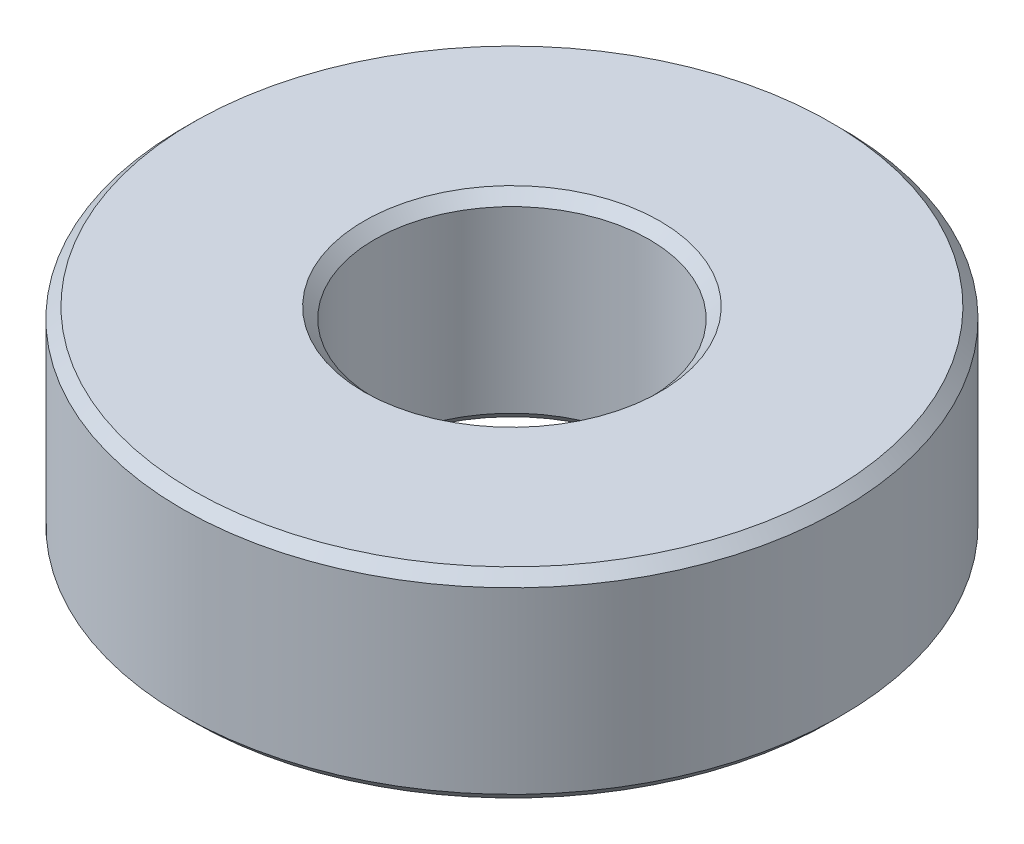
ISO-10303-21;
HEADER;
FILE_DESCRIPTION(('STEP AP214'),'2;1');
FILE_NAME('part.step','',(''),(''),'','','');
FILE_SCHEMA(('AUTOMOTIVE_DESIGN { 1 0 10303 214 1 1 1 1 }'));
ENDSEC;
DATA;
#1=APPLICATION_CONTEXT('core data for automotive mechanical design processes');
#2=APPLICATION_PROTOCOL_DEFINITION('international standard','automotive_design',2000,#1);
#3=PRODUCT_CONTEXT('',#1,'mechanical');
#4=PRODUCT('Part','Part','',(#3));
#5=PRODUCT_RELATED_PRODUCT_CATEGORY('part','',(#4));
#6=PRODUCT_DEFINITION_FORMATION('','',#4);
#7=PRODUCT_DEFINITION_CONTEXT('part definition',#1,'design');
#8=PRODUCT_DEFINITION('design','',#6,#7);
#9=PRODUCT_DEFINITION_SHAPE('','',#8);
#10=(LENGTH_UNIT() NAMED_UNIT(*) SI_UNIT(.MILLI.,.METRE.));
#11=(NAMED_UNIT(*) PLANE_ANGLE_UNIT() SI_UNIT($,.RADIAN.));
#12=(NAMED_UNIT(*) SI_UNIT($,.STERADIAN.) SOLID_ANGLE_UNIT());
#13=UNCERTAINTY_MEASURE_WITH_UNIT(LENGTH_MEASURE(1.E-05),#10,'distance_accuracy_value','');
#14=(GEOMETRIC_REPRESENTATION_CONTEXT(3) GLOBAL_UNCERTAINTY_ASSIGNED_CONTEXT((#13)) GLOBAL_UNIT_ASSIGNED_CONTEXT((#10,
#11,#12)) REPRESENTATION_CONTEXT('',''));
#15=CARTESIAN_POINT('',(0.,0.,0.));
#16=DIRECTION('',(0.,0.,1.));
#17=DIRECTION('',(1.,0.,0.));
#18=AXIS2_PLACEMENT_3D('',#15,#16,#17);
#19=CARTESIAN_POINT('',(0.,4.7752,0.));
#20=DIRECTION('',(0.,1.,0.));
#21=DIRECTION('',(0.,0.,1.));
#22=AXIS2_PLACEMENT_3D('',#19,#20,#21);
#23=PLANE('',#22);
#24=CARTESIAN_POINT('',(0.,4.7752,0.));
#25=DIRECTION('',(0.,1.,0.));
#26=DIRECTION('',(0.,0.,1.));
#27=AXIS2_PLACEMENT_3D('',#24,#25,#26);
#28=CIRCLE('',#27,3.5306);
#29=CARTESIAN_POINT('',(0.,4.7752,3.5306));
#30=VERTEX_POINT('',#29);
#31=EDGE_CURVE('E10',#30,#30,#28,.F.);
#32=ORIENTED_EDGE('',*,*,#31,.T.);
#33=EDGE_LOOP('',(#32));
#34=FACE_BOUND('',#33,.T.);
#35=CARTESIAN_POINT('',(0.,4.7752,0.));
#36=DIRECTION('',(0.,1.,0.));
#37=DIRECTION('',(0.,0.,1.));
#38=AXIS2_PLACEMENT_3D('',#35,#36,#37);
#39=CIRCLE('',#38,7.6073);
#40=CARTESIAN_POINT('',(0.,4.7752,7.6073));
#41=VERTEX_POINT('',#40);
#42=EDGE_CURVE('E48',#41,#41,#39,.T.);
#43=ORIENTED_EDGE('',*,*,#42,.T.);
#44=EDGE_LOOP('',(#43));
#45=FACE_BOUND('',#44,.T.);
#46=ADVANCED_FACE('F39',(#34,#45),#23,.T.);
#47=CARTESIAN_POINT('',(0.,0.,0.));
#48=DIRECTION('',(0.,1.,0.));
#49=DIRECTION('',(0.,0.,1.));
#50=AXIS2_PLACEMENT_3D('',#47,#48,#49);
#51=PLANE('',#50);
#52=CARTESIAN_POINT('',(0.,0.,0.));
#53=DIRECTION('',(0.,1.,0.));
#54=DIRECTION('',(0.,0.,1.));
#55=AXIS2_PLACEMENT_3D('',#52,#53,#54);
#56=CIRCLE('',#55,3.5306);
#57=CARTESIAN_POINT('',(0.,0.,3.5306));
#58=VERTEX_POINT('',#57);
#59=EDGE_CURVE('E72',#58,#58,#56,.T.);
#60=ORIENTED_EDGE('',*,*,#59,.T.);
#61=EDGE_LOOP('',(#60));
#62=FACE_BOUND('',#61,.T.);
#63=CARTESIAN_POINT('',(0.,0.,0.));
#64=DIRECTION('',(0.,1.,0.));
#65=DIRECTION('',(0.,0.,1.));
#66=AXIS2_PLACEMENT_3D('',#63,#64,#65);
#67=CIRCLE('',#66,7.6073);
#68=CARTESIAN_POINT('',(0.,0.,7.6073));
#69=VERTEX_POINT('',#68);
#70=EDGE_CURVE('E76',#69,#69,#67,.F.);
#71=ORIENTED_EDGE('',*,*,#70,.T.);
#72=EDGE_LOOP('',(#71));
#73=FACE_BOUND('',#72,.T.);
#74=ADVANCED_FACE('F81',(#62,#73),#51,.F.);
#75=CARTESIAN_POINT('',(0.,4.7752,0.));
#76=DIRECTION('',(0.,-1.,0.));
#77=DIRECTION('',(0.,0.,-1.));
#78=AXIS2_PLACEMENT_3D('',#75,#76,#77);
#79=CYLINDRICAL_SURFACE('',#78,7.8613);
#80=CARTESIAN_POINT('',(0.,0.253999999999996,0.));
#81=DIRECTION('',(0.,1.,0.));
#82=DIRECTION('',(0.,0.,1.));
#83=AXIS2_PLACEMENT_3D('',#80,#81,#82);
#84=CIRCLE('',#83,7.8613);
#85=CARTESIAN_POINT('',(0.,0.253999999999996,7.8613));
#86=VERTEX_POINT('',#85);
#87=EDGE_CURVE('E53',#86,#86,#84,.T.);
#88=ORIENTED_EDGE('',*,*,#87,.T.);
#89=EDGE_LOOP('',(#88));
#90=FACE_BOUND('',#89,.T.);
#91=CARTESIAN_POINT('',(0.,4.5212,0.));
#92=DIRECTION('',(0.,1.,0.));
#93=DIRECTION('',(0.,0.,1.));
#94=AXIS2_PLACEMENT_3D('',#91,#92,#93);
#95=CIRCLE('',#94,7.8613);
#96=CARTESIAN_POINT('',(0.,4.5212,7.8613));
#97=VERTEX_POINT('',#96);
#98=EDGE_CURVE('E58',#97,#97,#95,.F.);
#99=ORIENTED_EDGE('',*,*,#98,.T.);
#100=EDGE_LOOP('',(#99));
#101=FACE_BOUND('',#100,.T.);
#102=ADVANCED_FACE('F91',(#90,#101),#79,.T.);
#103=CARTESIAN_POINT('',(0.,4.7752,0.));
#104=DIRECTION('',(0.,-1.,0.));
#105=DIRECTION('',(0.,0.,-1.));
#106=AXIS2_PLACEMENT_3D('',#103,#104,#105);
#107=CYLINDRICAL_SURFACE('',#106,3.2766);
#108=CARTESIAN_POINT('',(0.,0.254000000000004,0.));
#109=DIRECTION('',(0.,1.,0.));
#110=DIRECTION('',(0.,0.,1.));
#111=AXIS2_PLACEMENT_3D('',#108,#109,#110);
#112=CIRCLE('',#111,3.2766);
#113=CARTESIAN_POINT('',(0.,0.254000000000004,3.2766));
#114=VERTEX_POINT('',#113);
#115=EDGE_CURVE('E64',#114,#114,#112,.F.);
#116=ORIENTED_EDGE('',*,*,#115,.T.);
#117=EDGE_LOOP('',(#116));
#118=FACE_BOUND('',#117,.T.);
#119=CARTESIAN_POINT('',(0.,4.5212,0.));
#120=DIRECTION('',(0.,1.,0.));
#121=DIRECTION('',(0.,0.,1.));
#122=AXIS2_PLACEMENT_3D('',#119,#120,#121);
#123=CIRCLE('',#122,3.2766);
#124=CARTESIAN_POINT('',(0.,4.5212,3.2766));
#125=VERTEX_POINT('',#124);
#126=EDGE_CURVE('E68',#125,#125,#123,.T.);
#127=ORIENTED_EDGE('',*,*,#126,.T.);
#128=EDGE_LOOP('',(#127));
#129=FACE_BOUND('',#128,.T.);
#130=ADVANCED_FACE('F94',(#118,#129),#107,.F.);
#131=CARTESIAN_POINT('',(0.,0.,0.));
#132=DIRECTION('',(0.,-1.,0.));
#133=DIRECTION('',(0.,0.,-1.));
#134=AXIS2_PLACEMENT_3D('',#131,#132,#133);
#135=CONICAL_SURFACE('',#134,3.5306,0.785398163397446);
#136=ORIENTED_EDGE('',*,*,#115,.F.);
#137=EDGE_LOOP('',(#136));
#138=FACE_BOUND('',#137,.T.);
#139=ORIENTED_EDGE('',*,*,#59,.F.);
#140=EDGE_LOOP('',(#139));
#141=FACE_BOUND('',#140,.T.);
#142=ADVANCED_FACE('F87',(#138,#141),#135,.F.);
#143=CARTESIAN_POINT('',(0.,0.253999999999996,0.));
#144=DIRECTION('',(0.,1.,0.));
#145=DIRECTION('',(0.,0.,1.));
#146=AXIS2_PLACEMENT_3D('',#143,#144,#145);
#147=CONICAL_SURFACE('',#146,7.8613,0.785398163397452);
#148=ORIENTED_EDGE('',*,*,#70,.F.);
#149=EDGE_LOOP('',(#148));
#150=FACE_BOUND('',#149,.T.);
#151=ORIENTED_EDGE('',*,*,#87,.F.);
#152=EDGE_LOOP('',(#151));
#153=FACE_BOUND('',#152,.T.);
#154=ADVANCED_FACE('F83',(#150,#153),#147,.T.);
#155=CARTESIAN_POINT('',(0.,4.5212,0.));
#156=DIRECTION('',(0.,1.,0.));
#157=DIRECTION('',(0.,0.,1.));
#158=AXIS2_PLACEMENT_3D('',#155,#156,#157);
#159=CONICAL_SURFACE('',#158,3.2766,0.785398163397446);
#160=ORIENTED_EDGE('',*,*,#31,.F.);
#161=EDGE_LOOP('',(#160));
#162=FACE_BOUND('',#161,.T.);
#163=ORIENTED_EDGE('',*,*,#126,.F.);
#164=EDGE_LOOP('',(#163));
#165=FACE_BOUND('',#164,.T.);
#166=ADVANCED_FACE('F86',(#162,#165),#159,.F.);
#167=CARTESIAN_POINT('',(0.,4.7752,0.));
#168=DIRECTION('',(0.,-1.,0.));
#169=DIRECTION('',(0.,0.,-1.));
#170=AXIS2_PLACEMENT_3D('',#167,#168,#169);
#171=CONICAL_SURFACE('',#170,7.6073,0.785398163397445);
#172=ORIENTED_EDGE('',*,*,#98,.F.);
#173=EDGE_LOOP('',(#172));
#174=FACE_BOUND('',#173,.T.);
#175=ORIENTED_EDGE('',*,*,#42,.F.);
#176=EDGE_LOOP('',(#175));
#177=FACE_BOUND('',#176,.T.);
#178=ADVANCED_FACE('F42',(#174,#177),#171,.T.);
#179=CLOSED_SHELL('',(#46,#74,#102,#130,#142,#154,#166,#178));
#180=MANIFOLD_SOLID_BREP('B2',#179);
#181=ADVANCED_BREP_SHAPE_REPRESENTATION('',(#18,#180),#14);
#182=SHAPE_DEFINITION_REPRESENTATION(#9,#181);
ENDSEC;
END-ISO-10303-21;
